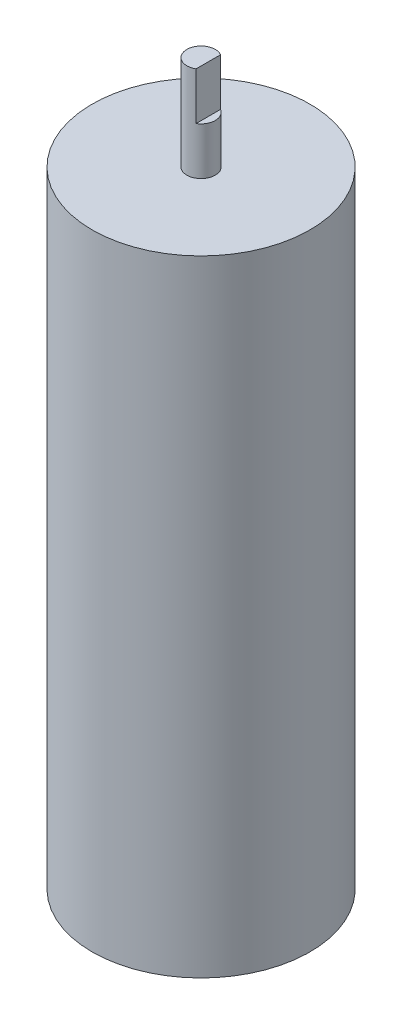
ISO-10303-21;
HEADER;
FILE_DESCRIPTION(('STEP AP214'),'2;1');
FILE_NAME('part.step','',(''),(''),'','','');
FILE_SCHEMA(('AUTOMOTIVE_DESIGN { 1 0 10303 214 1 1 1 1 }'));
ENDSEC;
DATA;
#1=APPLICATION_CONTEXT('core data for automotive mechanical design processes');
#2=APPLICATION_PROTOCOL_DEFINITION('international standard','automotive_design',2000,#1);
#3=PRODUCT_CONTEXT('',#1,'mechanical');
#4=PRODUCT('Part','Part','',(#3));
#5=PRODUCT_RELATED_PRODUCT_CATEGORY('part','',(#4));
#6=PRODUCT_DEFINITION_FORMATION('','',#4);
#7=PRODUCT_DEFINITION_CONTEXT('part definition',#1,'design');
#8=PRODUCT_DEFINITION('design','',#6,#7);
#9=PRODUCT_DEFINITION_SHAPE('','',#8);
#10=(LENGTH_UNIT() NAMED_UNIT(*) SI_UNIT(.MILLI.,.METRE.));
#11=(NAMED_UNIT(*) PLANE_ANGLE_UNIT() SI_UNIT($,.RADIAN.));
#12=(NAMED_UNIT(*) SI_UNIT($,.STERADIAN.) SOLID_ANGLE_UNIT());
#13=UNCERTAINTY_MEASURE_WITH_UNIT(LENGTH_MEASURE(1.E-05),#10,'distance_accuracy_value','');
#14=(GEOMETRIC_REPRESENTATION_CONTEXT(3) GLOBAL_UNCERTAINTY_ASSIGNED_CONTEXT((#13)) GLOBAL_UNIT_ASSIGNED_CONTEXT((#10,
#11,#12)) REPRESENTATION_CONTEXT('',''));
#15=CARTESIAN_POINT('',(0.,0.,0.));
#16=DIRECTION('',(0.,0.,1.));
#17=DIRECTION('',(1.,0.,0.));
#18=AXIS2_PLACEMENT_3D('',#15,#16,#17);
#19=CARTESIAN_POINT('',(0.,66.,0.));
#20=DIRECTION('',(0.,-1.,0.));
#21=DIRECTION('',(0.,0.,-1.));
#22=AXIS2_PLACEMENT_3D('',#19,#20,#21);
#23=CYLINDRICAL_SURFACE('',#22,11.5);
#24=CARTESIAN_POINT('',(0.,66.,0.));
#25=DIRECTION('',(0.,1.,0.));
#26=DIRECTION('',(0.,0.,1.));
#27=AXIS2_PLACEMENT_3D('',#24,#25,#26);
#28=CIRCLE('',#27,11.5);
#29=CARTESIAN_POINT('',(0.,66.,11.5));
#30=VERTEX_POINT('',#29);
#31=EDGE_CURVE('E78',#30,#30,#28,.T.);
#32=ORIENTED_EDGE('',*,*,#31,.F.);
#33=EDGE_LOOP('',(#32));
#34=FACE_BOUND('',#33,.T.);
#35=CARTESIAN_POINT('',(0.,0.,0.));
#36=DIRECTION('',(0.,1.,0.));
#37=DIRECTION('',(0.,0.,1.));
#38=AXIS2_PLACEMENT_3D('',#35,#36,#37);
#39=CIRCLE('',#38,11.5);
#40=CARTESIAN_POINT('',(0.,0.,11.5));
#41=VERTEX_POINT('',#40);
#42=EDGE_CURVE('E75',#41,#41,#39,.T.);
#43=ORIENTED_EDGE('',*,*,#42,.T.);
#44=EDGE_LOOP('',(#43));
#45=FACE_BOUND('',#44,.T.);
#46=ADVANCED_FACE('F34',(#34,#45),#23,.T.);
#47=CARTESIAN_POINT('',(0.,66.,0.));
#48=DIRECTION('',(0.,1.,0.));
#49=DIRECTION('',(0.,0.,1.));
#50=AXIS2_PLACEMENT_3D('',#47,#48,#49);
#51=PLANE('',#50);
#52=CARTESIAN_POINT('',(0.,66.,0.));
#53=DIRECTION('',(0.,1.,0.));
#54=DIRECTION('',(0.,0.,1.));
#55=AXIS2_PLACEMENT_3D('',#52,#53,#54);
#56=CIRCLE('',#55,1.5);
#57=CARTESIAN_POINT('',(0.,66.,1.5));
#58=VERTEX_POINT('',#57);
#59=EDGE_CURVE('E72',#58,#58,#56,.T.);
#60=ORIENTED_EDGE('',*,*,#59,.F.);
#61=EDGE_LOOP('',(#60));
#62=FACE_BOUND('',#61,.T.);
#63=ORIENTED_EDGE('',*,*,#31,.T.);
#64=EDGE_LOOP('',(#63));
#65=FACE_BOUND('',#64,.T.);
#66=ADVANCED_FACE('F105',(#62,#65),#51,.T.);
#67=CARTESIAN_POINT('',(0.,0.,0.));
#68=DIRECTION('',(0.,1.,0.));
#69=DIRECTION('',(0.,0.,1.));
#70=AXIS2_PLACEMENT_3D('',#67,#68,#69);
#71=PLANE('',#70);
#72=CARTESIAN_POINT('',(0.,0.,0.));
#73=DIRECTION('',(0.,1.,0.));
#74=DIRECTION('',(0.,0.,1.));
#75=AXIS2_PLACEMENT_3D('',#72,#73,#74);
#76=CIRCLE('',#75,1.5);
#77=CARTESIAN_POINT('',(0.,0.,1.5));
#78=VERTEX_POINT('',#77);
#79=EDGE_CURVE('E85',#78,#78,#76,.F.);
#80=ORIENTED_EDGE('',*,*,#79,.F.);
#81=EDGE_LOOP('',(#80));
#82=FACE_BOUND('',#81,.T.);
#83=ORIENTED_EDGE('',*,*,#42,.F.);
#84=EDGE_LOOP('',(#83));
#85=FACE_BOUND('',#84,.T.);
#86=ADVANCED_FACE('F110',(#82,#85),#71,.F.);
#87=CARTESIAN_POINT('',(0.,76.,0.));
#88=DIRECTION('',(0.,-1.,0.));
#89=DIRECTION('',(0.,0.,-1.));
#90=AXIS2_PLACEMENT_3D('',#87,#88,#89);
#91=CYLINDRICAL_SURFACE('',#90,1.5);
#92=CARTESIAN_POINT('',(0.,76.,0.));
#93=DIRECTION('',(0.,1.,0.));
#94=DIRECTION('',(0.,0.,1.));
#95=AXIS2_PLACEMENT_3D('',#92,#93,#94);
#96=CIRCLE('',#95,1.5);
#97=CARTESIAN_POINT('',(0.765599936171316,76.,-1.28990570885413));
#98=VERTEX_POINT('',#97);
#99=CARTESIAN_POINT('',(0.765599936171317,76.,1.28990570885413));
#100=VERTEX_POINT('',#99);
#101=EDGE_CURVE('E71',#98,#100,#96,.T.);
#102=ORIENTED_EDGE('',*,*,#101,.F.);
#103=DIRECTION('',(0.,1.,0.));
#104=VECTOR('',#103,1.);
#105=CARTESIAN_POINT('',(0.765599936171316,71.,-1.28990570885413));
#106=LINE('',#105,#104);
#107=CARTESIAN_POINT('',(0.765599936171316,71.,-1.28990570885413));
#108=VERTEX_POINT('',#107);
#109=EDGE_CURVE('E49',#108,#98,#106,.T.);
#110=ORIENTED_EDGE('',*,*,#109,.F.);
#111=CARTESIAN_POINT('',(0.,71.,0.));
#112=DIRECTION('',(0.,1.,0.));
#113=DIRECTION('',(0.,0.,1.));
#114=AXIS2_PLACEMENT_3D('',#111,#112,#113);
#115=CIRCLE('',#114,1.5);
#116=CARTESIAN_POINT('',(0.765599936171317,71.,1.28990570885413));
#117=VERTEX_POINT('',#116);
#118=EDGE_CURVE('E65',#117,#108,#115,.T.);
#119=ORIENTED_EDGE('',*,*,#118,.F.);
#120=DIRECTION('',(0.,1.,0.));
#121=VECTOR('',#120,1.);
#122=CARTESIAN_POINT('',(0.765599936171317,71.,1.28990570885413));
#123=LINE('',#122,#121);
#124=EDGE_CURVE('E55',#117,#100,#123,.T.);
#125=ORIENTED_EDGE('',*,*,#124,.T.);
#126=EDGE_LOOP('',(#102,#110,#119,#125));
#127=FACE_BOUND('',#126,.T.);
#128=ORIENTED_EDGE('',*,*,#59,.T.);
#129=EDGE_LOOP('',(#128));
#130=FACE_BOUND('',#129,.T.);
#131=ADVANCED_FACE('F69',(#127,#130),#91,.T.);
#132=CARTESIAN_POINT('',(0.,76.,0.));
#133=DIRECTION('',(0.,1.,0.));
#134=DIRECTION('',(0.,0.,1.));
#135=AXIS2_PLACEMENT_3D('',#132,#133,#134);
#136=PLANE('',#135);
#137=DIRECTION('',(0.,0.,1.));
#138=VECTOR('',#137,1.);
#139=CARTESIAN_POINT('',(0.765599936171316,76.,-1.28990570885413));
#140=LINE('',#139,#138);
#141=EDGE_CURVE('E60',#98,#100,#140,.T.);
#142=ORIENTED_EDGE('',*,*,#141,.F.);
#143=ORIENTED_EDGE('',*,*,#101,.T.);
#144=EDGE_LOOP('',(#142,#143));
#145=FACE_BOUND('',#144,.T.);
#146=ADVANCED_FACE('F74',(#145),#136,.T.);
#147=CARTESIAN_POINT('',(0.,-6.,0.));
#148=DIRECTION('',(0.,1.,0.));
#149=DIRECTION('',(0.,0.,1.));
#150=AXIS2_PLACEMENT_3D('',#147,#148,#149);
#151=CYLINDRICAL_SURFACE('',#150,1.5);
#152=CARTESIAN_POINT('',(0.,-5.5,0.));
#153=DIRECTION('',(0.,-1.,0.));
#154=DIRECTION('',(0.,0.,-1.));
#155=AXIS2_PLACEMENT_3D('',#152,#153,#154);
#156=CIRCLE('',#155,1.5);
#157=CARTESIAN_POINT('',(0.,-5.5,-1.5));
#158=VERTEX_POINT('',#157);
#159=EDGE_CURVE('E11',#158,#158,#156,.F.);
#160=ORIENTED_EDGE('',*,*,#159,.T.);
#161=EDGE_LOOP('',(#160));
#162=FACE_BOUND('',#161,.T.);
#163=ORIENTED_EDGE('',*,*,#79,.T.);
#164=EDGE_LOOP('',(#163));
#165=FACE_BOUND('',#164,.T.);
#166=ADVANCED_FACE('F101',(#162,#165),#151,.T.);
#167=CARTESIAN_POINT('',(0.,-6.,0.));
#168=DIRECTION('',(0.,-1.,0.));
#169=DIRECTION('',(0.,0.,-1.));
#170=AXIS2_PLACEMENT_3D('',#167,#168,#169);
#171=PLANE('',#170);
#172=CARTESIAN_POINT('',(0.,-6.,0.));
#173=DIRECTION('',(0.,-1.,0.));
#174=DIRECTION('',(0.,0.,-1.));
#175=AXIS2_PLACEMENT_3D('',#172,#173,#174);
#176=CIRCLE('',#175,1.);
#177=CARTESIAN_POINT('',(0.,-6.,-1.));
#178=VERTEX_POINT('',#177);
#179=EDGE_CURVE('E42',#178,#178,#176,.T.);
#180=ORIENTED_EDGE('',*,*,#179,.T.);
#181=EDGE_LOOP('',(#180));
#182=FACE_BOUND('',#181,.T.);
#183=ADVANCED_FACE('F91',(#182),#171,.T.);
#184=CARTESIAN_POINT('',(0.,-5.5,0.));
#185=DIRECTION('',(0.,-1.,0.));
#186=DIRECTION('',(0.,0.,-1.));
#187=AXIS2_PLACEMENT_3D('',#184,#185,#186);
#188=TOROIDAL_SURFACE('',#187,1.,0.5);
#189=ORIENTED_EDGE('',*,*,#159,.F.);
#190=EDGE_LOOP('',(#189));
#191=FACE_BOUND('',#190,.T.);
#192=ORIENTED_EDGE('',*,*,#179,.F.);
#193=EDGE_LOOP('',(#192));
#194=FACE_BOUND('',#193,.T.);
#195=ADVANCED_FACE('F36',(#191,#194),#188,.T.);
#196=CARTESIAN_POINT('',(0.765599936171316,71.,-1.28990570885413));
#197=DIRECTION('',(-1.,0.,0.));
#198=DIRECTION('',(0.,0.,1.));
#199=AXIS2_PLACEMENT_3D('',#196,#197,#198);
#200=PLANE('',#199);
#201=ORIENTED_EDGE('',*,*,#141,.T.);
#202=ORIENTED_EDGE('',*,*,#124,.F.);
#203=DIRECTION('',(0.,0.,1.));
#204=VECTOR('',#203,1.);
#205=CARTESIAN_POINT('',(0.765599936171316,71.,-1.28990570885413));
#206=LINE('',#205,#204);
#207=EDGE_CURVE('E130',#108,#117,#206,.T.);
#208=ORIENTED_EDGE('',*,*,#207,.F.);
#209=ORIENTED_EDGE('',*,*,#109,.T.);
#210=EDGE_LOOP('',(#201,#202,#208,#209));
#211=FACE_BOUND('',#210,.T.);
#212=ADVANCED_FACE('F61',(#211),#200,.F.);
#213=CARTESIAN_POINT('',(0.,71.,0.));
#214=DIRECTION('',(0.,1.,0.));
#215=DIRECTION('',(0.,0.,1.));
#216=AXIS2_PLACEMENT_3D('',#213,#214,#215);
#217=PLANE('',#216);
#218=ORIENTED_EDGE('',*,*,#118,.T.);
#219=ORIENTED_EDGE('',*,*,#207,.T.);
#220=EDGE_LOOP('',(#218,#219));
#221=FACE_BOUND('',#220,.T.);
#222=ADVANCED_FACE('F99',(#221),#217,.T.);
#223=CLOSED_SHELL('',(#46,#66,#86,#131,#146,#166,#183,#195,#212,#222));
#224=MANIFOLD_SOLID_BREP('B2',#223);
#225=ADVANCED_BREP_SHAPE_REPRESENTATION('',(#18,#224),#14);
#226=SHAPE_DEFINITION_REPRESENTATION(#9,#225);
ENDSEC;
END-ISO-10303-21;
